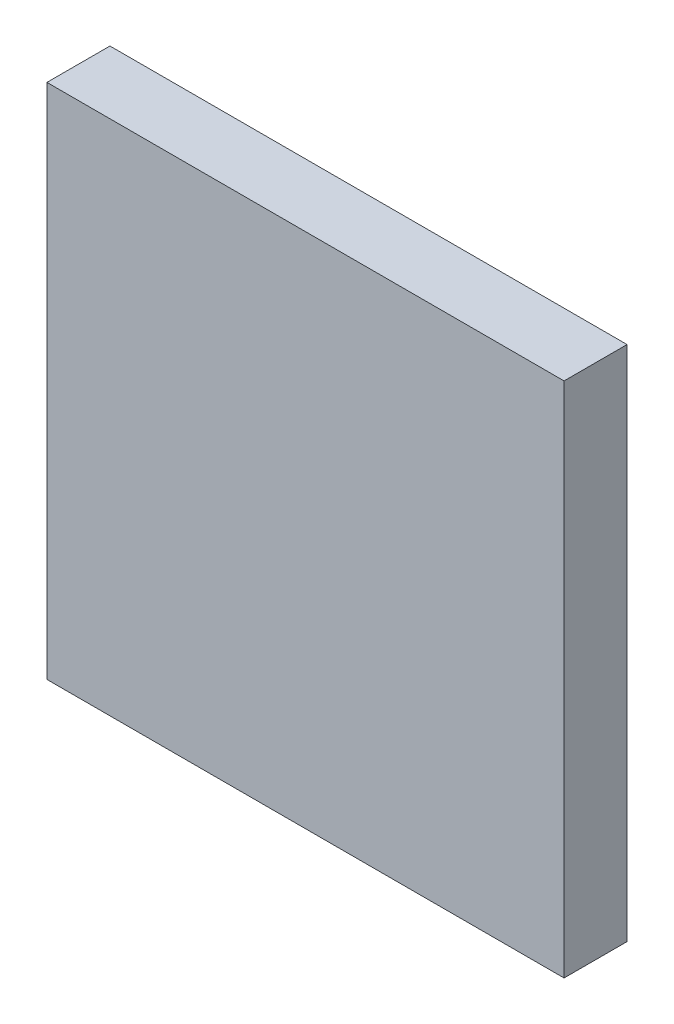
ISO-10303-21;
HEADER;
FILE_DESCRIPTION(('STEP AP214'),'2;1');
FILE_NAME('part.step','',(''),(''),'','','');
FILE_SCHEMA(('AUTOMOTIVE_DESIGN { 1 0 10303 214 1 1 1 1 }'));
ENDSEC;
DATA;
#1=APPLICATION_CONTEXT('core data for automotive mechanical design processes');
#2=APPLICATION_PROTOCOL_DEFINITION('international standard','automotive_design',2000,#1);
#3=PRODUCT_CONTEXT('',#1,'mechanical');
#4=PRODUCT('Part','Part','',(#3));
#5=PRODUCT_RELATED_PRODUCT_CATEGORY('part','',(#4));
#6=PRODUCT_DEFINITION_FORMATION('','',#4);
#7=PRODUCT_DEFINITION_CONTEXT('part definition',#1,'design');
#8=PRODUCT_DEFINITION('design','',#6,#7);
#9=PRODUCT_DEFINITION_SHAPE('','',#8);
#10=(LENGTH_UNIT() NAMED_UNIT(*) SI_UNIT(.MILLI.,.METRE.));
#11=(NAMED_UNIT(*) PLANE_ANGLE_UNIT() SI_UNIT($,.RADIAN.));
#12=(NAMED_UNIT(*) SI_UNIT($,.STERADIAN.) SOLID_ANGLE_UNIT());
#13=UNCERTAINTY_MEASURE_WITH_UNIT(LENGTH_MEASURE(1.E-05),#10,'distance_accuracy_value','');
#14=(GEOMETRIC_REPRESENTATION_CONTEXT(3) GLOBAL_UNCERTAINTY_ASSIGNED_CONTEXT((#13)) GLOBAL_UNIT_ASSIGNED_CONTEXT((#10,
#11,#12)) REPRESENTATION_CONTEXT('',''));
#15=CARTESIAN_POINT('',(0.,0.,0.));
#16=DIRECTION('',(0.,0.,1.));
#17=DIRECTION('',(1.,0.,0.));
#18=AXIS2_PLACEMENT_3D('',#15,#16,#17);
#19=CARTESIAN_POINT('',(-73.6542196603611,-16.5687289451098,5.75183006783528));
#20=DIRECTION('',(-4.96198164063515E-05,0.,-0.999999998768937));
#21=DIRECTION('',(-0.999999998768937,0.,4.96198164063515E-05));
#22=AXIS2_PLACEMENT_3D('',#19,#20,#21);
#23=PLANE('',#22);
#24=DIRECTION('',(-2.31907983959186E-06,-0.999999999997311,1.15072157410576E-10));
#25=VECTOR('',#24,1.);
#26=CARTESIAN_POINT('',(-70.1542115478997,-13.0687370618987,5.75165639807511));
#27=LINE('',#26,#25);
#28=CARTESIAN_POINT('',(-70.1542115478997,-13.0687370618987,5.75165639807511));
#29=VERTEX_POINT('',#28);
#30=CARTESIAN_POINT('',(-70.154227781421,-20.0687208283209,5.75165639888061));
#31=VERTEX_POINT('',#30);
#32=EDGE_CURVE('E25',#29,#31,#27,.T.);
#33=ORIENTED_EDGE('',*,*,#32,.F.);
#34=DIRECTION('',(0.999999998768937,0.,-4.96198164063515E-05));
#35=VECTOR('',#34,1.);
#36=CARTESIAN_POINT('',(-77.1542277728224,-13.0687370618987,5.75200373759546));
#37=LINE('',#36,#35);
#38=CARTESIAN_POINT('',(-77.1542277728224,-13.0687370618987,5.75200373759546));
#39=VERTEX_POINT('',#38);
#40=EDGE_CURVE('E82',#39,#29,#37,.T.);
#41=ORIENTED_EDGE('',*,*,#40,.F.);
#42=DIRECTION('',(0.,1.,0.));
#43=VECTOR('',#42,1.);
#44=CARTESIAN_POINT('',(-77.1542277728224,-20.0687208283209,5.75200373759546));
#45=LINE('',#44,#43);
#46=CARTESIAN_POINT('',(-77.1542277728224,-20.0687208283209,5.75200373759546));
#47=VERTEX_POINT('',#46);
#48=EDGE_CURVE('E64',#47,#39,#45,.T.);
#49=ORIENTED_EDGE('',*,*,#48,.F.);
#50=DIRECTION('',(-0.999999998768937,0.,4.96198164061929E-05));
#51=VECTOR('',#50,1.);
#52=CARTESIAN_POINT('',(-70.1542115478997,-20.0687208283209,5.75165639807511));
#53=LINE('',#52,#51);
#54=EDGE_CURVE('E102',#31,#47,#53,.T.);
#55=ORIENTED_EDGE('',*,*,#54,.F.);
#56=EDGE_LOOP('',(#33,#41,#49,#55));
#57=FACE_BOUND('',#56,.T.);
#58=ADVANCED_FACE('F16',(#57),#23,.F.);
#59=CARTESIAN_POINT('',(-73.6542619860645,-16.5687289451098,4.89883006888539));
#60=DIRECTION('',(-4.9619816407342E-05,0.,-0.999999998768937));
#61=DIRECTION('',(-0.999999998768937,0.,4.9619816407342E-05));
#62=AXIS2_PLACEMENT_3D('',#59,#60,#61);
#63=PLANE('',#62);
#64=DIRECTION('',(-2.31907983959186E-06,-0.999999999997311,1.15072157410576E-10));
#65=VECTOR('',#64,1.);
#66=CARTESIAN_POINT('',(-70.1542538736032,-13.0687370618987,4.89865639912521));
#67=LINE('',#66,#65);
#68=CARTESIAN_POINT('',(-70.1542538736032,-13.0687370618987,4.89865639912521));
#69=VERTEX_POINT('',#68);
#70=CARTESIAN_POINT('',(-70.1542701071244,-20.0687208283209,4.89865639993071));
#71=VERTEX_POINT('',#70);
#72=EDGE_CURVE('E10',#69,#71,#67,.T.);
#73=ORIENTED_EDGE('',*,*,#72,.T.);
#74=DIRECTION('',(-0.999999998768937,0.,4.96198164061929E-05));
#75=VECTOR('',#74,1.);
#76=CARTESIAN_POINT('',(-70.1542538736032,-20.0687208283209,4.89865639912521));
#77=LINE('',#76,#75);
#78=CARTESIAN_POINT('',(-77.1542700985258,-20.0687208283209,4.89900373864555));
#79=VERTEX_POINT('',#78);
#80=EDGE_CURVE('E105',#71,#79,#77,.T.);
#81=ORIENTED_EDGE('',*,*,#80,.T.);
#82=DIRECTION('',(0.,1.,0.));
#83=VECTOR('',#82,1.);
#84=CARTESIAN_POINT('',(-77.1542700985258,-20.0687208283209,4.89900373864555));
#85=LINE('',#84,#83);
#86=CARTESIAN_POINT('',(-77.1542700985258,-13.0687370618987,4.89900373864556));
#87=VERTEX_POINT('',#86);
#88=EDGE_CURVE('E76',#79,#87,#85,.T.);
#89=ORIENTED_EDGE('',*,*,#88,.T.);
#90=DIRECTION('',(0.999999998768937,0.,-4.96198164063515E-05));
#91=VECTOR('',#90,1.);
#92=CARTESIAN_POINT('',(-77.1542700985258,-13.0687370618987,4.89900373864556));
#93=LINE('',#92,#91);
#94=EDGE_CURVE('E83',#87,#69,#93,.T.);
#95=ORIENTED_EDGE('',*,*,#94,.T.);
#96=EDGE_LOOP('',(#73,#81,#89,#95));
#97=FACE_BOUND('',#96,.T.);
#98=ADVANCED_FACE('F119',(#97),#63,.T.);
#99=CARTESIAN_POINT('',(-70.1542115478997,-13.0687370618987,5.75165639807511));
#100=DIRECTION('',(0.999999998766248,-2.31907984244678E-06,-4.96198164072086E-05));
#101=DIRECTION('',(0.,-0.998909613853616,0.0466860080840137));
#102=AXIS2_PLACEMENT_3D('',#99,#100,#101);
#103=PLANE('',#102);
#104=ORIENTED_EDGE('',*,*,#32,.T.);
#105=DIRECTION('',(-4.9619816407342E-05,0.,-0.999999998768937));
#106=VECTOR('',#105,1.);
#107=CARTESIAN_POINT('',(-70.154227781421,-20.0687208283209,5.75165639888061));
#108=LINE('',#107,#106);
#109=EDGE_CURVE('E108',#31,#71,#108,.T.);
#110=ORIENTED_EDGE('',*,*,#109,.T.);
#111=ORIENTED_EDGE('',*,*,#72,.F.);
#112=DIRECTION('',(-4.9619816407342E-05,0.,-0.999999998768937));
#113=VECTOR('',#112,1.);
#114=CARTESIAN_POINT('',(-70.1542115478997,-13.0687370618987,5.75165639807511));
#115=LINE('',#114,#113);
#116=EDGE_CURVE('E88',#29,#69,#115,.T.);
#117=ORIENTED_EDGE('',*,*,#116,.F.);
#118=EDGE_LOOP('',(#104,#110,#111,#117));
#119=FACE_BOUND('',#118,.T.);
#120=ADVANCED_FACE('F115',(#119),#103,.T.);
#121=CARTESIAN_POINT('',(-70.154227781421,-20.0687208283209,5.75165639888061));
#122=DIRECTION('',(0.,-1.,0.));
#123=DIRECTION('',(0.,0.,-1.));
#124=AXIS2_PLACEMENT_3D('',#121,#122,#123);
#125=PLANE('',#124);
#126=ORIENTED_EDGE('',*,*,#54,.T.);
#127=DIRECTION('',(-4.9619816407342E-05,0.,-0.999999998768937));
#128=VECTOR('',#127,1.);
#129=CARTESIAN_POINT('',(-77.1542277728224,-20.0687208283209,5.75200373759546));
#130=LINE('',#129,#128);
#131=EDGE_CURVE('E71',#47,#79,#130,.T.);
#132=ORIENTED_EDGE('',*,*,#131,.T.);
#133=ORIENTED_EDGE('',*,*,#80,.F.);
#134=ORIENTED_EDGE('',*,*,#109,.F.);
#135=EDGE_LOOP('',(#126,#132,#133,#134));
#136=FACE_BOUND('',#135,.T.);
#137=ADVANCED_FACE('F118',(#136),#125,.T.);
#138=CARTESIAN_POINT('',(-77.1542277728224,-20.0687208283209,5.75200373759546));
#139=DIRECTION('',(-0.999999998768937,0.,4.9619816407342E-05));
#140=DIRECTION('',(0.,1.,0.));
#141=AXIS2_PLACEMENT_3D('',#138,#139,#140);
#142=PLANE('',#141);
#143=ORIENTED_EDGE('',*,*,#48,.T.);
#144=DIRECTION('',(-4.9619816407342E-05,0.,-0.999999998768937));
#145=VECTOR('',#144,1.);
#146=CARTESIAN_POINT('',(-77.1542277728224,-13.0687370618987,5.75200373759546));
#147=LINE('',#146,#145);
#148=EDGE_CURVE('E68',#39,#87,#147,.T.);
#149=ORIENTED_EDGE('',*,*,#148,.T.);
#150=ORIENTED_EDGE('',*,*,#88,.F.);
#151=ORIENTED_EDGE('',*,*,#131,.F.);
#152=EDGE_LOOP('',(#143,#149,#150,#151));
#153=FACE_BOUND('',#152,.T.);
#154=ADVANCED_FACE('F66',(#153),#142,.T.);
#155=CARTESIAN_POINT('',(-77.1542277728224,-13.0687370618987,5.75200373759546));
#156=DIRECTION('',(0.,1.,0.));
#157=DIRECTION('',(1.,0.,0.));
#158=AXIS2_PLACEMENT_3D('',#155,#156,#157);
#159=PLANE('',#158);
#160=ORIENTED_EDGE('',*,*,#40,.T.);
#161=ORIENTED_EDGE('',*,*,#116,.T.);
#162=ORIENTED_EDGE('',*,*,#94,.F.);
#163=ORIENTED_EDGE('',*,*,#148,.F.);
#164=EDGE_LOOP('',(#160,#161,#162,#163));
#165=FACE_BOUND('',#164,.T.);
#166=ADVANCED_FACE('F80',(#165),#159,.T.);
#167=CLOSED_SHELL('',(#58,#98,#120,#137,#154,#166));
#168=MANIFOLD_SOLID_BREP('B1',#167);
#169=ADVANCED_BREP_SHAPE_REPRESENTATION('',(#18,#168),#14);
#170=SHAPE_DEFINITION_REPRESENTATION(#9,#169);
ENDSEC;
END-ISO-10303-21;
